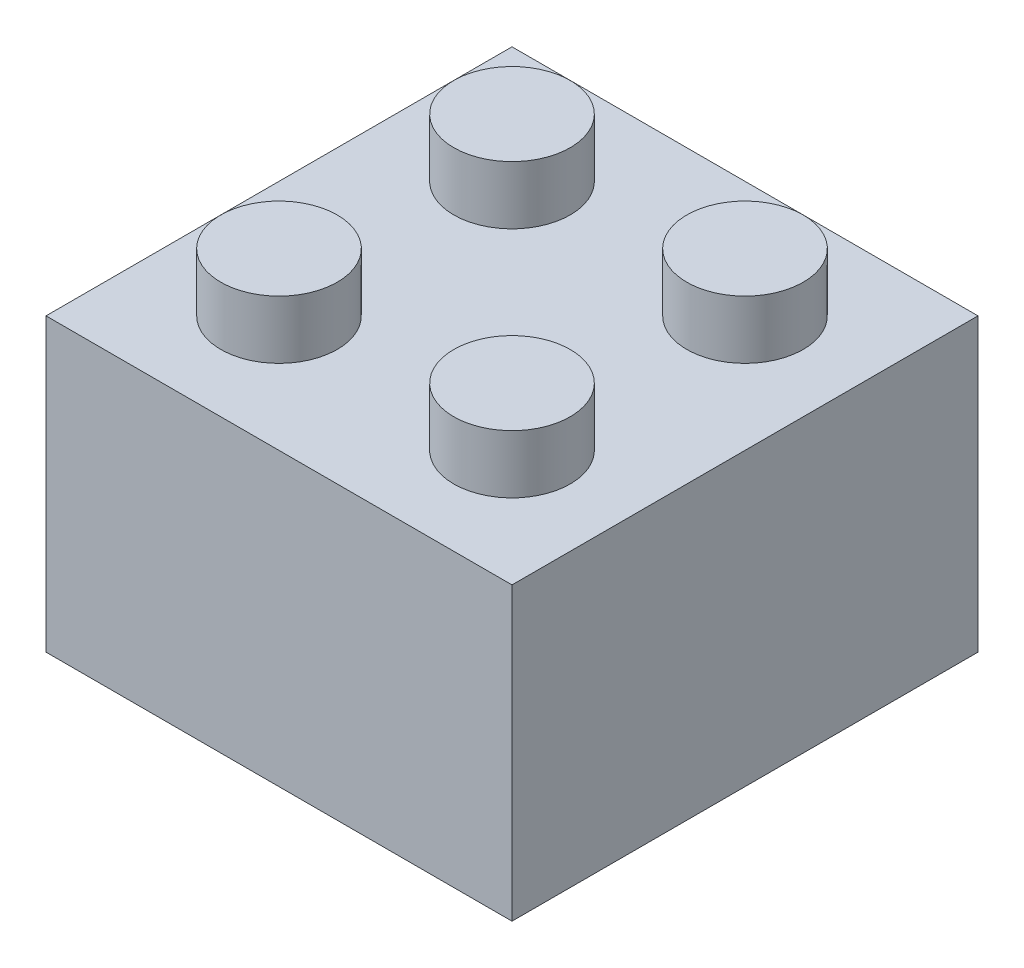
ISO-10303-21;
HEADER;
FILE_DESCRIPTION(('STEP AP214'),'2;1');
FILE_NAME('part.step','',(''),(''),'','','');
FILE_SCHEMA(('AUTOMOTIVE_DESIGN { 1 0 10303 214 1 1 1 1 }'));
ENDSEC;
DATA;
#1=APPLICATION_CONTEXT('core data for automotive mechanical design processes');
#2=APPLICATION_PROTOCOL_DEFINITION('international standard','automotive_design',2000,#1);
#3=PRODUCT_CONTEXT('',#1,'mechanical');
#4=PRODUCT('Part','Part','',(#3));
#5=PRODUCT_RELATED_PRODUCT_CATEGORY('part','',(#4));
#6=PRODUCT_DEFINITION_FORMATION('','',#4);
#7=PRODUCT_DEFINITION_CONTEXT('part definition',#1,'design');
#8=PRODUCT_DEFINITION('design','',#6,#7);
#9=PRODUCT_DEFINITION_SHAPE('','',#8);
#10=(LENGTH_UNIT() NAMED_UNIT(*) SI_UNIT(.MILLI.,.METRE.));
#11=(NAMED_UNIT(*) PLANE_ANGLE_UNIT() SI_UNIT($,.RADIAN.));
#12=(NAMED_UNIT(*) SI_UNIT($,.STERADIAN.) SOLID_ANGLE_UNIT());
#13=UNCERTAINTY_MEASURE_WITH_UNIT(LENGTH_MEASURE(1.E-05),#10,'distance_accuracy_value','');
#14=(GEOMETRIC_REPRESENTATION_CONTEXT(3) GLOBAL_UNCERTAINTY_ASSIGNED_CONTEXT((#13)) GLOBAL_UNIT_ASSIGNED_CONTEXT((#10,
#11,#12)) REPRESENTATION_CONTEXT('',''));
#15=CARTESIAN_POINT('',(0.,0.,0.));
#16=DIRECTION('',(0.,0.,1.));
#17=DIRECTION('',(1.,0.,0.));
#18=AXIS2_PLACEMENT_3D('',#15,#16,#17);
#19=CARTESIAN_POINT('',(-8.,10.,8.));
#20=DIRECTION('',(1.,0.,0.));
#21=DIRECTION('',(0.,0.,-1.));
#22=AXIS2_PLACEMENT_3D('',#19,#20,#21);
#23=PLANE('',#22);
#24=DIRECTION('',(0.,0.,1.));
#25=VECTOR('',#24,1.);
#26=CARTESIAN_POINT('',(-8.,0.,8.));
#27=LINE('',#26,#25);
#28=CARTESIAN_POINT('',(-8.,0.,-8.));
#29=VERTEX_POINT('',#28);
#30=CARTESIAN_POINT('',(-8.,0.,8.));
#31=VERTEX_POINT('',#30);
#32=EDGE_CURVE('E241',#29,#31,#27,.T.);
#33=ORIENTED_EDGE('',*,*,#32,.T.);
#34=DIRECTION('',(0.,-1.,0.));
#35=VECTOR('',#34,1.);
#36=CARTESIAN_POINT('',(-8.,10.,8.));
#37=LINE('',#36,#35);
#38=CARTESIAN_POINT('',(-8.,10.,8.));
#39=VERTEX_POINT('',#38);
#40=EDGE_CURVE('E59',#39,#31,#37,.T.);
#41=ORIENTED_EDGE('',*,*,#40,.F.);
#42=DIRECTION('',(0.,0.,1.));
#43=VECTOR('',#42,1.);
#44=CARTESIAN_POINT('',(-8.,10.,8.));
#45=LINE('',#44,#43);
#46=CARTESIAN_POINT('',(-8.,10.,-8.));
#47=VERTEX_POINT('',#46);
#48=EDGE_CURVE('E245',#47,#39,#45,.T.);
#49=ORIENTED_EDGE('',*,*,#48,.F.);
#50=DIRECTION('',(0.,-1.,0.));
#51=VECTOR('',#50,1.);
#52=CARTESIAN_POINT('',(-8.,10.,-8.));
#53=LINE('',#52,#51);
#54=EDGE_CURVE('E255',#47,#29,#53,.T.);
#55=ORIENTED_EDGE('',*,*,#54,.T.);
#56=EDGE_LOOP('',(#33,#41,#49,#55));
#57=FACE_BOUND('',#56,.T.);
#58=ADVANCED_FACE('F51',(#57),#23,.F.);
#59=CARTESIAN_POINT('',(8.,10.,8.));
#60=DIRECTION('',(0.,0.,-1.));
#61=DIRECTION('',(-1.,0.,0.));
#62=AXIS2_PLACEMENT_3D('',#59,#60,#61);
#63=PLANE('',#62);
#64=DIRECTION('',(1.,0.,0.));
#65=VECTOR('',#64,1.);
#66=CARTESIAN_POINT('',(8.,0.,8.));
#67=LINE('',#66,#65);
#68=CARTESIAN_POINT('',(8.,0.,8.));
#69=VERTEX_POINT('',#68);
#70=EDGE_CURVE('E259',#31,#69,#67,.T.);
#71=ORIENTED_EDGE('',*,*,#70,.T.);
#72=DIRECTION('',(0.,-1.,0.));
#73=VECTOR('',#72,1.);
#74=CARTESIAN_POINT('',(8.,10.,8.));
#75=LINE('',#74,#73);
#76=CARTESIAN_POINT('',(8.,10.,8.));
#77=VERTEX_POINT('',#76);
#78=EDGE_CURVE('E272',#77,#69,#75,.T.);
#79=ORIENTED_EDGE('',*,*,#78,.F.);
#80=DIRECTION('',(1.,0.,0.));
#81=VECTOR('',#80,1.);
#82=CARTESIAN_POINT('',(8.,10.,8.));
#83=LINE('',#82,#81);
#84=EDGE_CURVE('E104',#39,#77,#83,.T.);
#85=ORIENTED_EDGE('',*,*,#84,.F.);
#86=ORIENTED_EDGE('',*,*,#40,.T.);
#87=EDGE_LOOP('',(#71,#79,#85,#86));
#88=FACE_BOUND('',#87,.T.);
#89=ADVANCED_FACE('F277',(#88),#63,.F.);
#90=CARTESIAN_POINT('',(8.,10.,8.));
#91=DIRECTION('',(-1.,0.,0.));
#92=DIRECTION('',(0.,0.,1.));
#93=AXIS2_PLACEMENT_3D('',#90,#91,#92);
#94=PLANE('',#93);
#95=DIRECTION('',(0.,0.,-1.));
#96=VECTOR('',#95,1.);
#97=CARTESIAN_POINT('',(8.,0.,8.));
#98=LINE('',#97,#96);
#99=CARTESIAN_POINT('',(8.,0.,-8.));
#100=VERTEX_POINT('',#99);
#101=EDGE_CURVE('E262',#69,#100,#98,.T.);
#102=ORIENTED_EDGE('',*,*,#101,.T.);
#103=DIRECTION('',(0.,-1.,0.));
#104=VECTOR('',#103,1.);
#105=CARTESIAN_POINT('',(8.,10.,-8.));
#106=LINE('',#105,#104);
#107=CARTESIAN_POINT('',(8.,10.,-8.));
#108=VERTEX_POINT('',#107);
#109=EDGE_CURVE('E269',#108,#100,#106,.T.);
#110=ORIENTED_EDGE('',*,*,#109,.F.);
#111=DIRECTION('',(0.,0.,-1.));
#112=VECTOR('',#111,1.);
#113=CARTESIAN_POINT('',(8.,10.,8.));
#114=LINE('',#113,#112);
#115=EDGE_CURVE('E250',#77,#108,#114,.T.);
#116=ORIENTED_EDGE('',*,*,#115,.F.);
#117=ORIENTED_EDGE('',*,*,#78,.T.);
#118=EDGE_LOOP('',(#102,#110,#116,#117));
#119=FACE_BOUND('',#118,.T.);
#120=ADVANCED_FACE('F286',(#119),#94,.F.);
#121=CARTESIAN_POINT('',(8.,10.,-8.));
#122=DIRECTION('',(0.,0.,1.));
#123=DIRECTION('',(1.,0.,0.));
#124=AXIS2_PLACEMENT_3D('',#121,#122,#123);
#125=PLANE('',#124);
#126=DIRECTION('',(-1.,0.,0.));
#127=VECTOR('',#126,1.);
#128=CARTESIAN_POINT('',(8.,0.,-8.));
#129=LINE('',#128,#127);
#130=EDGE_CURVE('E96',#100,#29,#129,.T.);
#131=ORIENTED_EDGE('',*,*,#130,.T.);
#132=ORIENTED_EDGE('',*,*,#54,.F.);
#133=DIRECTION('',(-1.,0.,0.));
#134=VECTOR('',#133,1.);
#135=CARTESIAN_POINT('',(8.,10.,-8.));
#136=LINE('',#135,#134);
#137=EDGE_CURVE('E75',#108,#47,#136,.T.);
#138=ORIENTED_EDGE('',*,*,#137,.F.);
#139=ORIENTED_EDGE('',*,*,#109,.T.);
#140=EDGE_LOOP('',(#131,#132,#138,#139));
#141=FACE_BOUND('',#140,.T.);
#142=ADVANCED_FACE('F288',(#141),#125,.F.);
#143=CARTESIAN_POINT('',(0.,10.,0.));
#144=DIRECTION('',(0.,1.,0.));
#145=DIRECTION('',(0.,0.,1.));
#146=AXIS2_PLACEMENT_3D('',#143,#144,#145);
#147=PLANE('',#146);
#148=CARTESIAN_POINT('',(-4.,10.,4.));
#149=DIRECTION('',(0.,1.,0.));
#150=DIRECTION('',(0.,0.,-1.));
#151=AXIS2_PLACEMENT_3D('',#148,#149,#150);
#152=CIRCLE('',#151,2.);
#153=CARTESIAN_POINT('',(-4.,10.,2.));
#154=VERTEX_POINT('',#153);
#155=EDGE_CURVE('E158',#154,#154,#152,.T.);
#156=ORIENTED_EDGE('',*,*,#155,.F.);
#157=EDGE_LOOP('',(#156));
#158=FACE_BOUND('',#157,.T.);
#159=CARTESIAN_POINT('',(4.,10.,4.));
#160=DIRECTION('',(0.,1.,0.));
#161=DIRECTION('',(0.,0.,1.));
#162=AXIS2_PLACEMENT_3D('',#159,#160,#161);
#163=CIRCLE('',#162,2.);
#164=CARTESIAN_POINT('',(4.,10.,6.));
#165=VERTEX_POINT('',#164);
#166=EDGE_CURVE('E226',#165,#165,#163,.T.);
#167=ORIENTED_EDGE('',*,*,#166,.F.);
#168=EDGE_LOOP('',(#167));
#169=FACE_BOUND('',#168,.T.);
#170=CARTESIAN_POINT('',(4.,10.,-4.));
#171=DIRECTION('',(0.,1.,0.));
#172=DIRECTION('',(0.,0.,-1.));
#173=AXIS2_PLACEMENT_3D('',#170,#171,#172);
#174=CIRCLE('',#173,2.);
#175=CARTESIAN_POINT('',(4.,10.,-6.));
#176=VERTEX_POINT('',#175);
#177=EDGE_CURVE('E217',#176,#176,#174,.T.);
#178=ORIENTED_EDGE('',*,*,#177,.F.);
#179=EDGE_LOOP('',(#178));
#180=FACE_BOUND('',#179,.T.);
#181=CARTESIAN_POINT('',(-4.,10.,-4.));
#182=DIRECTION('',(0.,1.,0.));
#183=DIRECTION('',(0.,0.,1.));
#184=AXIS2_PLACEMENT_3D('',#181,#182,#183);
#185=CIRCLE('',#184,2.);
#186=CARTESIAN_POINT('',(-4.,10.,-2.));
#187=VERTEX_POINT('',#186);
#188=EDGE_CURVE('E221',#187,#187,#185,.T.);
#189=ORIENTED_EDGE('',*,*,#188,.F.);
#190=EDGE_LOOP('',(#189));
#191=FACE_BOUND('',#190,.T.);
#192=ORIENTED_EDGE('',*,*,#48,.T.);
#193=ORIENTED_EDGE('',*,*,#84,.T.);
#194=ORIENTED_EDGE('',*,*,#115,.T.);
#195=ORIENTED_EDGE('',*,*,#137,.T.);
#196=EDGE_LOOP('',(#192,#193,#194,#195));
#197=FACE_BOUND('',#196,.T.);
#198=ADVANCED_FACE('F289',(#158,#169,#180,#191,#197),#147,.T.);
#199=CARTESIAN_POINT('',(0.,0.,0.));
#200=DIRECTION('',(0.,1.,0.));
#201=DIRECTION('',(0.,0.,1.));
#202=AXIS2_PLACEMENT_3D('',#199,#200,#201);
#203=PLANE('',#202);
#204=DIRECTION('',(-1.,0.,0.));
#205=VECTOR('',#204,1.);
#206=CARTESIAN_POINT('',(8.,0.,-7.));
#207=LINE('',#206,#205);
#208=CARTESIAN_POINT('',(7.,0.,-7.));
#209=VERTEX_POINT('',#208);
#210=CARTESIAN_POINT('',(-7.,0.,-7.));
#211=VERTEX_POINT('',#210);
#212=EDGE_CURVE('E146',#209,#211,#207,.T.);
#213=ORIENTED_EDGE('',*,*,#212,.T.);
#214=DIRECTION('',(0.,0.,1.));
#215=VECTOR('',#214,1.);
#216=CARTESIAN_POINT('',(-7.,0.,8.));
#217=LINE('',#216,#215);
#218=CARTESIAN_POINT('',(-7.,0.,7.));
#219=VERTEX_POINT('',#218);
#220=EDGE_CURVE('E198',#211,#219,#217,.T.);
#221=ORIENTED_EDGE('',*,*,#220,.T.);
#222=DIRECTION('',(1.,0.,0.));
#223=VECTOR('',#222,1.);
#224=CARTESIAN_POINT('',(8.,0.,7.));
#225=LINE('',#224,#223);
#226=CARTESIAN_POINT('',(7.,0.,7.));
#227=VERTEX_POINT('',#226);
#228=EDGE_CURVE('E150',#219,#227,#225,.T.);
#229=ORIENTED_EDGE('',*,*,#228,.T.);
#230=DIRECTION('',(0.,0.,-1.));
#231=VECTOR('',#230,1.);
#232=CARTESIAN_POINT('',(7.,0.,8.));
#233=LINE('',#232,#231);
#234=EDGE_CURVE('E66',#227,#209,#233,.T.);
#235=ORIENTED_EDGE('',*,*,#234,.T.);
#236=EDGE_LOOP('',(#213,#221,#229,#235));
#237=FACE_BOUND('',#236,.T.);
#238=ORIENTED_EDGE('',*,*,#32,.F.);
#239=ORIENTED_EDGE('',*,*,#130,.F.);
#240=ORIENTED_EDGE('',*,*,#101,.F.);
#241=ORIENTED_EDGE('',*,*,#70,.F.);
#242=EDGE_LOOP('',(#238,#239,#240,#241));
#243=FACE_BOUND('',#242,.T.);
#244=ADVANCED_FACE('F282',(#237,#243),#203,.F.);
#245=CARTESIAN_POINT('',(-4.,12.,-4.));
#246=DIRECTION('',(0.,-1.,0.));
#247=DIRECTION('',(0.,0.,-1.));
#248=AXIS2_PLACEMENT_3D('',#245,#246,#247);
#249=CYLINDRICAL_SURFACE('',#248,2.);
#250=CARTESIAN_POINT('',(-4.,12.,-4.));
#251=DIRECTION('',(0.,1.,0.));
#252=DIRECTION('',(0.,0.,1.));
#253=AXIS2_PLACEMENT_3D('',#250,#251,#252);
#254=CIRCLE('',#253,2.);
#255=CARTESIAN_POINT('',(-4.,12.,-2.));
#256=VERTEX_POINT('',#255);
#257=EDGE_CURVE('E237',#256,#256,#254,.T.);
#258=ORIENTED_EDGE('',*,*,#257,.F.);
#259=EDGE_LOOP('',(#258));
#260=FACE_BOUND('',#259,.T.);
#261=ORIENTED_EDGE('',*,*,#188,.T.);
#262=EDGE_LOOP('',(#261));
#263=FACE_BOUND('',#262,.T.);
#264=ADVANCED_FACE('F298',(#260,#263),#249,.T.);
#265=CARTESIAN_POINT('',(-4.,12.,-4.));
#266=DIRECTION('',(0.,1.,0.));
#267=DIRECTION('',(0.,0.,1.));
#268=AXIS2_PLACEMENT_3D('',#265,#266,#267);
#269=PLANE('',#268);
#270=ORIENTED_EDGE('',*,*,#257,.T.);
#271=EDGE_LOOP('',(#270));
#272=FACE_BOUND('',#271,.T.);
#273=ADVANCED_FACE('F341',(#272),#269,.T.);
#274=CARTESIAN_POINT('',(4.,12.,-4.));
#275=DIRECTION('',(0.,-1.,0.));
#276=DIRECTION('',(0.,0.,-1.));
#277=AXIS2_PLACEMENT_3D('',#274,#275,#276);
#278=CYLINDRICAL_SURFACE('',#277,2.);
#279=CARTESIAN_POINT('',(4.,12.,-4.));
#280=DIRECTION('',(0.,1.,0.));
#281=DIRECTION('',(0.,0.,-1.));
#282=AXIS2_PLACEMENT_3D('',#279,#280,#281);
#283=CIRCLE('',#282,2.);
#284=CARTESIAN_POINT('',(4.,12.,-6.));
#285=VERTEX_POINT('',#284);
#286=EDGE_CURVE('E222',#285,#285,#283,.T.);
#287=ORIENTED_EDGE('',*,*,#286,.F.);
#288=EDGE_LOOP('',(#287));
#289=FACE_BOUND('',#288,.T.);
#290=ORIENTED_EDGE('',*,*,#177,.T.);
#291=EDGE_LOOP('',(#290));
#292=FACE_BOUND('',#291,.T.);
#293=ADVANCED_FACE('F350',(#289,#292),#278,.T.);
#294=CARTESIAN_POINT('',(4.,12.,-4.));
#295=DIRECTION('',(0.,-1.,0.));
#296=DIRECTION('',(0.,0.,-1.));
#297=AXIS2_PLACEMENT_3D('',#294,#295,#296);
#298=PLANE('',#297);
#299=ORIENTED_EDGE('',*,*,#286,.T.);
#300=EDGE_LOOP('',(#299));
#301=FACE_BOUND('',#300,.T.);
#302=ADVANCED_FACE('F360',(#301),#298,.F.);
#303=CARTESIAN_POINT('',(4.,12.,4.));
#304=DIRECTION('',(0.,-1.,0.));
#305=DIRECTION('',(0.,0.,-1.));
#306=AXIS2_PLACEMENT_3D('',#303,#304,#305);
#307=CYLINDRICAL_SURFACE('',#306,2.);
#308=CARTESIAN_POINT('',(4.,12.,4.));
#309=DIRECTION('',(0.,1.,0.));
#310=DIRECTION('',(0.,0.,1.));
#311=AXIS2_PLACEMENT_3D('',#308,#309,#310);
#312=CIRCLE('',#311,2.);
#313=CARTESIAN_POINT('',(4.,12.,6.));
#314=VERTEX_POINT('',#313);
#315=EDGE_CURVE('E230',#314,#314,#312,.T.);
#316=ORIENTED_EDGE('',*,*,#315,.F.);
#317=EDGE_LOOP('',(#316));
#318=FACE_BOUND('',#317,.T.);
#319=ORIENTED_EDGE('',*,*,#166,.T.);
#320=EDGE_LOOP('',(#319));
#321=FACE_BOUND('',#320,.T.);
#322=ADVANCED_FACE('F370',(#318,#321),#307,.T.);
#323=CARTESIAN_POINT('',(4.,12.,4.));
#324=DIRECTION('',(0.,1.,0.));
#325=DIRECTION('',(0.,0.,1.));
#326=AXIS2_PLACEMENT_3D('',#323,#324,#325);
#327=PLANE('',#326);
#328=ORIENTED_EDGE('',*,*,#315,.T.);
#329=EDGE_LOOP('',(#328));
#330=FACE_BOUND('',#329,.T.);
#331=ADVANCED_FACE('F380',(#330),#327,.T.);
#332=CARTESIAN_POINT('',(-4.,12.,4.));
#333=DIRECTION('',(0.,-1.,0.));
#334=DIRECTION('',(0.,0.,-1.));
#335=AXIS2_PLACEMENT_3D('',#332,#333,#334);
#336=CYLINDRICAL_SURFACE('',#335,2.);
#337=CARTESIAN_POINT('',(-4.,12.,4.));
#338=DIRECTION('',(0.,1.,0.));
#339=DIRECTION('',(0.,0.,-1.));
#340=AXIS2_PLACEMENT_3D('',#337,#338,#339);
#341=CIRCLE('',#340,2.);
#342=CARTESIAN_POINT('',(-4.,12.,2.));
#343=VERTEX_POINT('',#342);
#344=EDGE_CURVE('E152',#343,#343,#341,.T.);
#345=ORIENTED_EDGE('',*,*,#344,.F.);
#346=EDGE_LOOP('',(#345));
#347=FACE_BOUND('',#346,.T.);
#348=ORIENTED_EDGE('',*,*,#155,.T.);
#349=EDGE_LOOP('',(#348));
#350=FACE_BOUND('',#349,.T.);
#351=ADVANCED_FACE('F390',(#347,#350),#336,.T.);
#352=CARTESIAN_POINT('',(-4.,12.,4.));
#353=DIRECTION('',(0.,-1.,0.));
#354=DIRECTION('',(0.,0.,-1.));
#355=AXIS2_PLACEMENT_3D('',#352,#353,#354);
#356=PLANE('',#355);
#357=ORIENTED_EDGE('',*,*,#344,.T.);
#358=EDGE_LOOP('',(#357));
#359=FACE_BOUND('',#358,.T.);
#360=ADVANCED_FACE('F400',(#359),#356,.F.);
#361=CARTESIAN_POINT('',(-7.,10.,8.));
#362=DIRECTION('',(1.,0.,0.));
#363=DIRECTION('',(0.,0.,-1.));
#364=AXIS2_PLACEMENT_3D('',#361,#362,#363);
#365=PLANE('',#364);
#366=ORIENTED_EDGE('',*,*,#220,.F.);
#367=DIRECTION('',(0.,-1.,0.));
#368=VECTOR('',#367,1.);
#369=CARTESIAN_POINT('',(-7.,10.,-7.));
#370=LINE('',#369,#368);
#371=CARTESIAN_POINT('',(-7.,9.,-7.));
#372=VERTEX_POINT('',#371);
#373=EDGE_CURVE('E144',#372,#211,#370,.T.);
#374=ORIENTED_EDGE('',*,*,#373,.F.);
#375=DIRECTION('',(0.,0.,1.));
#376=VECTOR('',#375,1.);
#377=CARTESIAN_POINT('',(-7.,9.,8.));
#378=LINE('',#377,#376);
#379=CARTESIAN_POINT('',(-7.,9.,7.));
#380=VERTEX_POINT('',#379);
#381=EDGE_CURVE('E131',#372,#380,#378,.T.);
#382=ORIENTED_EDGE('',*,*,#381,.T.);
#383=DIRECTION('',(0.,-1.,0.));
#384=VECTOR('',#383,1.);
#385=CARTESIAN_POINT('',(-7.,10.,7.));
#386=LINE('',#385,#384);
#387=EDGE_CURVE('E142',#380,#219,#386,.T.);
#388=ORIENTED_EDGE('',*,*,#387,.T.);
#389=EDGE_LOOP('',(#366,#374,#382,#388));
#390=FACE_BOUND('',#389,.T.);
#391=ADVANCED_FACE('F141',(#390),#365,.T.);
#392=CARTESIAN_POINT('',(8.,10.,7.));
#393=DIRECTION('',(0.,0.,-1.));
#394=DIRECTION('',(-1.,0.,0.));
#395=AXIS2_PLACEMENT_3D('',#392,#393,#394);
#396=PLANE('',#395);
#397=ORIENTED_EDGE('',*,*,#228,.F.);
#398=ORIENTED_EDGE('',*,*,#387,.F.);
#399=DIRECTION('',(1.,0.,0.));
#400=VECTOR('',#399,1.);
#401=CARTESIAN_POINT('',(8.,9.,7.));
#402=LINE('',#401,#400);
#403=CARTESIAN_POINT('',(7.,9.,7.));
#404=VERTEX_POINT('',#403);
#405=EDGE_CURVE('E127',#380,#404,#402,.T.);
#406=ORIENTED_EDGE('',*,*,#405,.T.);
#407=DIRECTION('',(0.,-1.,0.));
#408=VECTOR('',#407,1.);
#409=CARTESIAN_POINT('',(7.,10.,7.));
#410=LINE('',#409,#408);
#411=EDGE_CURVE('E153',#404,#227,#410,.T.);
#412=ORIENTED_EDGE('',*,*,#411,.T.);
#413=EDGE_LOOP('',(#397,#398,#406,#412));
#414=FACE_BOUND('',#413,.T.);
#415=ADVANCED_FACE('F148',(#414),#396,.T.);
#416=CARTESIAN_POINT('',(7.,10.,8.));
#417=DIRECTION('',(-1.,0.,0.));
#418=DIRECTION('',(0.,0.,1.));
#419=AXIS2_PLACEMENT_3D('',#416,#417,#418);
#420=PLANE('',#419);
#421=ORIENTED_EDGE('',*,*,#234,.F.);
#422=ORIENTED_EDGE('',*,*,#411,.F.);
#423=DIRECTION('',(0.,0.,-1.));
#424=VECTOR('',#423,1.);
#425=CARTESIAN_POINT('',(7.,9.,8.));
#426=LINE('',#425,#424);
#427=CARTESIAN_POINT('',(7.,9.,-7.));
#428=VERTEX_POINT('',#427);
#429=EDGE_CURVE('E132',#404,#428,#426,.T.);
#430=ORIENTED_EDGE('',*,*,#429,.T.);
#431=DIRECTION('',(0.,-1.,0.));
#432=VECTOR('',#431,1.);
#433=CARTESIAN_POINT('',(7.,10.,-7.));
#434=LINE('',#433,#432);
#435=EDGE_CURVE('E160',#428,#209,#434,.T.);
#436=ORIENTED_EDGE('',*,*,#435,.T.);
#437=EDGE_LOOP('',(#421,#422,#430,#436));
#438=FACE_BOUND('',#437,.T.);
#439=ADVANCED_FACE('F425',(#438),#420,.T.);
#440=CARTESIAN_POINT('',(8.,10.,-7.));
#441=DIRECTION('',(0.,0.,1.));
#442=DIRECTION('',(1.,0.,0.));
#443=AXIS2_PLACEMENT_3D('',#440,#441,#442);
#444=PLANE('',#443);
#445=ORIENTED_EDGE('',*,*,#212,.F.);
#446=ORIENTED_EDGE('',*,*,#435,.F.);
#447=DIRECTION('',(-1.,0.,0.));
#448=VECTOR('',#447,1.);
#449=CARTESIAN_POINT('',(8.,9.,-7.));
#450=LINE('',#449,#448);
#451=EDGE_CURVE('E167',#428,#372,#450,.T.);
#452=ORIENTED_EDGE('',*,*,#451,.T.);
#453=ORIENTED_EDGE('',*,*,#373,.T.);
#454=EDGE_LOOP('',(#445,#446,#452,#453));
#455=FACE_BOUND('',#454,.T.);
#456=ADVANCED_FACE('F434',(#455),#444,.T.);
#457=CARTESIAN_POINT('',(0.,9.,0.));
#458=DIRECTION('',(0.,1.,0.));
#459=DIRECTION('',(0.,0.,1.));
#460=AXIS2_PLACEMENT_3D('',#457,#458,#459);
#461=PLANE('',#460);
#462=CARTESIAN_POINT('',(0.,9.,0.));
#463=DIRECTION('',(0.,1.,0.));
#464=DIRECTION('',(0.,0.,1.));
#465=AXIS2_PLACEMENT_3D('',#462,#463,#464);
#466=CIRCLE('',#465,2.7);
#467=CARTESIAN_POINT('',(0.,9.,2.7));
#468=VERTEX_POINT('',#467);
#469=EDGE_CURVE('E11',#468,#468,#466,.F.);
#470=ORIENTED_EDGE('',*,*,#469,.F.);
#471=EDGE_LOOP('',(#470));
#472=FACE_BOUND('',#471,.T.);
#473=CARTESIAN_POINT('',(-4.,9.,4.));
#474=DIRECTION('',(0.,1.,0.));
#475=DIRECTION('',(0.,0.,1.));
#476=AXIS2_PLACEMENT_3D('',#473,#474,#475);
#477=CIRCLE('',#476,1.);
#478=CARTESIAN_POINT('',(-4.,9.,5.));
#479=VERTEX_POINT('',#478);
#480=EDGE_CURVE('E175',#479,#479,#477,.T.);
#481=ORIENTED_EDGE('',*,*,#480,.T.);
#482=EDGE_LOOP('',(#481));
#483=FACE_BOUND('',#482,.T.);
#484=CARTESIAN_POINT('',(4.,9.,4.));
#485=DIRECTION('',(0.,1.,0.));
#486=DIRECTION('',(0.,0.,1.));
#487=AXIS2_PLACEMENT_3D('',#484,#485,#486);
#488=CIRCLE('',#487,1.);
#489=CARTESIAN_POINT('',(4.,9.,5.));
#490=VERTEX_POINT('',#489);
#491=EDGE_CURVE('E181',#490,#490,#488,.T.);
#492=ORIENTED_EDGE('',*,*,#491,.T.);
#493=EDGE_LOOP('',(#492));
#494=FACE_BOUND('',#493,.T.);
#495=CARTESIAN_POINT('',(4.,9.,-4.));
#496=DIRECTION('',(0.,1.,0.));
#497=DIRECTION('',(0.,0.,1.));
#498=AXIS2_PLACEMENT_3D('',#495,#496,#497);
#499=CIRCLE('',#498,1.);
#500=CARTESIAN_POINT('',(4.,9.,-3.));
#501=VERTEX_POINT('',#500);
#502=EDGE_CURVE('E186',#501,#501,#499,.T.);
#503=ORIENTED_EDGE('',*,*,#502,.T.);
#504=EDGE_LOOP('',(#503));
#505=FACE_BOUND('',#504,.T.);
#506=CARTESIAN_POINT('',(-4.,9.,-4.));
#507=DIRECTION('',(0.,1.,0.));
#508=DIRECTION('',(0.,0.,1.));
#509=AXIS2_PLACEMENT_3D('',#506,#507,#508);
#510=CIRCLE('',#509,1.);
#511=CARTESIAN_POINT('',(-4.,9.,-3.));
#512=VERTEX_POINT('',#511);
#513=EDGE_CURVE('E190',#512,#512,#510,.T.);
#514=ORIENTED_EDGE('',*,*,#513,.T.);
#515=EDGE_LOOP('',(#514));
#516=FACE_BOUND('',#515,.T.);
#517=ORIENTED_EDGE('',*,*,#381,.F.);
#518=ORIENTED_EDGE('',*,*,#451,.F.);
#519=ORIENTED_EDGE('',*,*,#429,.F.);
#520=ORIENTED_EDGE('',*,*,#405,.F.);
#521=EDGE_LOOP('',(#517,#518,#519,#520));
#522=FACE_BOUND('',#521,.T.);
#523=ADVANCED_FACE('F129',(#472,#483,#494,#505,#516,#522),#461,.F.);
#524=CARTESIAN_POINT('',(-4.,12.,-4.));
#525=DIRECTION('',(0.,-1.,0.));
#526=DIRECTION('',(0.,0.,-1.));
#527=AXIS2_PLACEMENT_3D('',#524,#525,#526);
#528=CYLINDRICAL_SURFACE('',#527,1.);
#529=CARTESIAN_POINT('',(-4.,11.,-4.));
#530=DIRECTION('',(0.,1.,0.));
#531=DIRECTION('',(0.,0.,1.));
#532=AXIS2_PLACEMENT_3D('',#529,#530,#531);
#533=CIRCLE('',#532,1.);
#534=CARTESIAN_POINT('',(-4.,11.,-3.));
#535=VERTEX_POINT('',#534);
#536=EDGE_CURVE('E194',#535,#535,#533,.T.);
#537=ORIENTED_EDGE('',*,*,#536,.T.);
#538=EDGE_LOOP('',(#537));
#539=FACE_BOUND('',#538,.T.);
#540=ORIENTED_EDGE('',*,*,#513,.F.);
#541=EDGE_LOOP('',(#540));
#542=FACE_BOUND('',#541,.T.);
#543=ADVANCED_FACE('F453',(#539,#542),#528,.F.);
#544=CARTESIAN_POINT('',(-4.,11.,-4.));
#545=DIRECTION('',(0.,1.,0.));
#546=DIRECTION('',(0.,0.,1.));
#547=AXIS2_PLACEMENT_3D('',#544,#545,#546);
#548=PLANE('',#547);
#549=ORIENTED_EDGE('',*,*,#536,.F.);
#550=EDGE_LOOP('',(#549));
#551=FACE_BOUND('',#550,.T.);
#552=ADVANCED_FACE('F465',(#551),#548,.F.);
#553=CARTESIAN_POINT('',(4.,12.,-4.));
#554=DIRECTION('',(0.,-1.,0.));
#555=DIRECTION('',(0.,0.,-1.));
#556=AXIS2_PLACEMENT_3D('',#553,#554,#555);
#557=CYLINDRICAL_SURFACE('',#556,1.);
#558=CARTESIAN_POINT('',(4.,11.,-4.));
#559=DIRECTION('',(0.,-1.,0.));
#560=DIRECTION('',(0.,0.,-1.));
#561=AXIS2_PLACEMENT_3D('',#558,#559,#560);
#562=CIRCLE('',#561,1.);
#563=CARTESIAN_POINT('',(4.,11.,-5.));
#564=VERTEX_POINT('',#563);
#565=EDGE_CURVE('E185',#564,#564,#562,.F.);
#566=ORIENTED_EDGE('',*,*,#565,.T.);
#567=EDGE_LOOP('',(#566));
#568=FACE_BOUND('',#567,.T.);
#569=ORIENTED_EDGE('',*,*,#502,.F.);
#570=EDGE_LOOP('',(#569));
#571=FACE_BOUND('',#570,.T.);
#572=ADVANCED_FACE('F475',(#568,#571),#557,.F.);
#573=CARTESIAN_POINT('',(4.,11.,-4.));
#574=DIRECTION('',(0.,-1.,0.));
#575=DIRECTION('',(0.,0.,-1.));
#576=AXIS2_PLACEMENT_3D('',#573,#574,#575);
#577=PLANE('',#576);
#578=ORIENTED_EDGE('',*,*,#565,.F.);
#579=EDGE_LOOP('',(#578));
#580=FACE_BOUND('',#579,.T.);
#581=ADVANCED_FACE('F485',(#580),#577,.T.);
#582=CARTESIAN_POINT('',(4.,12.,4.));
#583=DIRECTION('',(0.,-1.,0.));
#584=DIRECTION('',(0.,0.,-1.));
#585=AXIS2_PLACEMENT_3D('',#582,#583,#584);
#586=CYLINDRICAL_SURFACE('',#585,1.);
#587=CARTESIAN_POINT('',(4.,11.,4.));
#588=DIRECTION('',(0.,1.,0.));
#589=DIRECTION('',(0.,0.,1.));
#590=AXIS2_PLACEMENT_3D('',#587,#588,#589);
#591=CIRCLE('',#590,1.);
#592=CARTESIAN_POINT('',(4.,11.,5.));
#593=VERTEX_POINT('',#592);
#594=EDGE_CURVE('E179',#593,#593,#591,.T.);
#595=ORIENTED_EDGE('',*,*,#594,.T.);
#596=EDGE_LOOP('',(#595));
#597=FACE_BOUND('',#596,.T.);
#598=ORIENTED_EDGE('',*,*,#491,.F.);
#599=EDGE_LOOP('',(#598));
#600=FACE_BOUND('',#599,.T.);
#601=ADVANCED_FACE('F495',(#597,#600),#586,.F.);
#602=CARTESIAN_POINT('',(4.,11.,4.));
#603=DIRECTION('',(0.,1.,0.));
#604=DIRECTION('',(0.,0.,1.));
#605=AXIS2_PLACEMENT_3D('',#602,#603,#604);
#606=PLANE('',#605);
#607=ORIENTED_EDGE('',*,*,#594,.F.);
#608=EDGE_LOOP('',(#607));
#609=FACE_BOUND('',#608,.T.);
#610=ADVANCED_FACE('F505',(#609),#606,.F.);
#611=CARTESIAN_POINT('',(-4.,12.,4.));
#612=DIRECTION('',(0.,-1.,0.));
#613=DIRECTION('',(0.,0.,-1.));
#614=AXIS2_PLACEMENT_3D('',#611,#612,#613);
#615=CYLINDRICAL_SURFACE('',#614,1.);
#616=CARTESIAN_POINT('',(-4.,11.,4.));
#617=DIRECTION('',(0.,-1.,0.));
#618=DIRECTION('',(0.,0.,-1.));
#619=AXIS2_PLACEMENT_3D('',#616,#617,#618);
#620=CIRCLE('',#619,1.);
#621=CARTESIAN_POINT('',(-4.,11.,3.));
#622=VERTEX_POINT('',#621);
#623=EDGE_CURVE('E180',#622,#622,#620,.F.);
#624=ORIENTED_EDGE('',*,*,#623,.T.);
#625=EDGE_LOOP('',(#624));
#626=FACE_BOUND('',#625,.T.);
#627=ORIENTED_EDGE('',*,*,#480,.F.);
#628=EDGE_LOOP('',(#627));
#629=FACE_BOUND('',#628,.T.);
#630=ADVANCED_FACE('F515',(#626,#629),#615,.F.);
#631=CARTESIAN_POINT('',(-4.,11.,4.));
#632=DIRECTION('',(0.,-1.,0.));
#633=DIRECTION('',(0.,0.,-1.));
#634=AXIS2_PLACEMENT_3D('',#631,#632,#633);
#635=PLANE('',#634);
#636=ORIENTED_EDGE('',*,*,#623,.F.);
#637=EDGE_LOOP('',(#636));
#638=FACE_BOUND('',#637,.T.);
#639=ADVANCED_FACE('F525',(#638),#635,.T.);
#640=CARTESIAN_POINT('',(0.,0.,0.));
#641=DIRECTION('',(0.,-1.,0.));
#642=DIRECTION('',(0.,0.,-1.));
#643=AXIS2_PLACEMENT_3D('',#640,#641,#642);
#644=PLANE('',#643);
#645=CARTESIAN_POINT('',(0.,0.,0.));
#646=DIRECTION('',(0.,-1.,0.));
#647=DIRECTION('',(0.,0.,-1.));
#648=AXIS2_PLACEMENT_3D('',#645,#646,#647);
#649=CIRCLE('',#648,2.7);
#650=CARTESIAN_POINT('',(0.,0.,-2.7));
#651=VERTEX_POINT('',#650);
#652=EDGE_CURVE('E163',#651,#651,#649,.T.);
#653=ORIENTED_EDGE('',*,*,#652,.T.);
#654=EDGE_LOOP('',(#653));
#655=FACE_BOUND('',#654,.T.);
#656=CARTESIAN_POINT('',(0.,0.,0.));
#657=DIRECTION('',(0.,-1.,0.));
#658=DIRECTION('',(0.,0.,-1.));
#659=AXIS2_PLACEMENT_3D('',#656,#657,#658);
#660=CIRCLE('',#659,1.7);
#661=CARTESIAN_POINT('',(0.,0.,-1.7));
#662=VERTEX_POINT('',#661);
#663=EDGE_CURVE('E614',#662,#662,#660,.T.);
#664=ORIENTED_EDGE('',*,*,#663,.F.);
#665=EDGE_LOOP('',(#664));
#666=FACE_BOUND('',#665,.T.);
#667=ADVANCED_FACE('F534',(#655,#666),#644,.T.);
#668=CARTESIAN_POINT('',(0.,0.,0.));
#669=DIRECTION('',(0.,1.,0.));
#670=DIRECTION('',(0.,0.,1.));
#671=AXIS2_PLACEMENT_3D('',#668,#669,#670);
#672=CYLINDRICAL_SURFACE('',#671,2.7);
#673=ORIENTED_EDGE('',*,*,#652,.F.);
#674=EDGE_LOOP('',(#673));
#675=FACE_BOUND('',#674,.T.);
#676=ORIENTED_EDGE('',*,*,#469,.T.);
#677=EDGE_LOOP('',(#676));
#678=FACE_BOUND('',#677,.T.);
#679=ADVANCED_FACE('F552',(#675,#678),#672,.T.);
#680=CARTESIAN_POINT('',(0.,0.,0.));
#681=DIRECTION('',(0.,1.,0.));
#682=DIRECTION('',(0.,0.,1.));
#683=AXIS2_PLACEMENT_3D('',#680,#681,#682);
#684=CYLINDRICAL_SURFACE('',#683,1.7);
#685=ORIENTED_EDGE('',*,*,#663,.T.);
#686=EDGE_LOOP('',(#685));
#687=FACE_BOUND('',#686,.T.);
#688=CARTESIAN_POINT('',(0.,9.,0.));
#689=DIRECTION('',(0.,-1.,0.));
#690=DIRECTION('',(0.,0.,-1.));
#691=AXIS2_PLACEMENT_3D('',#688,#689,#690);
#692=CIRCLE('',#691,1.7);
#693=CARTESIAN_POINT('',(0.,9.,-1.7));
#694=VERTEX_POINT('',#693);
#695=EDGE_CURVE('E617',#694,#694,#692,.T.);
#696=ORIENTED_EDGE('',*,*,#695,.F.);
#697=EDGE_LOOP('',(#696));
#698=FACE_BOUND('',#697,.T.);
#699=ADVANCED_FACE('F544',(#687,#698),#684,.F.);
#700=ORIENTED_EDGE('',*,*,#695,.T.);
#701=EDGE_LOOP('',(#700));
#702=FACE_BOUND('',#701,.T.);
#703=ADVANCED_FACE('F456',(#702),#461,.F.);
#704=CLOSED_SHELL('',(#58,#89,#120,#142,#198,#244,#264,#273,#293,#302,#322,#331,#351,#360,#391,
#415,#439,#456,#523,#543,#552,#572,#581,#601,#610,#630,#639,#667,#679,#699,#703));
#705=MANIFOLD_SOLID_BREP('B2',#704);
#706=ADVANCED_BREP_SHAPE_REPRESENTATION('',(#18,#705),#14);
#707=SHAPE_DEFINITION_REPRESENTATION(#9,#706);
ENDSEC;
END-ISO-10303-21;
